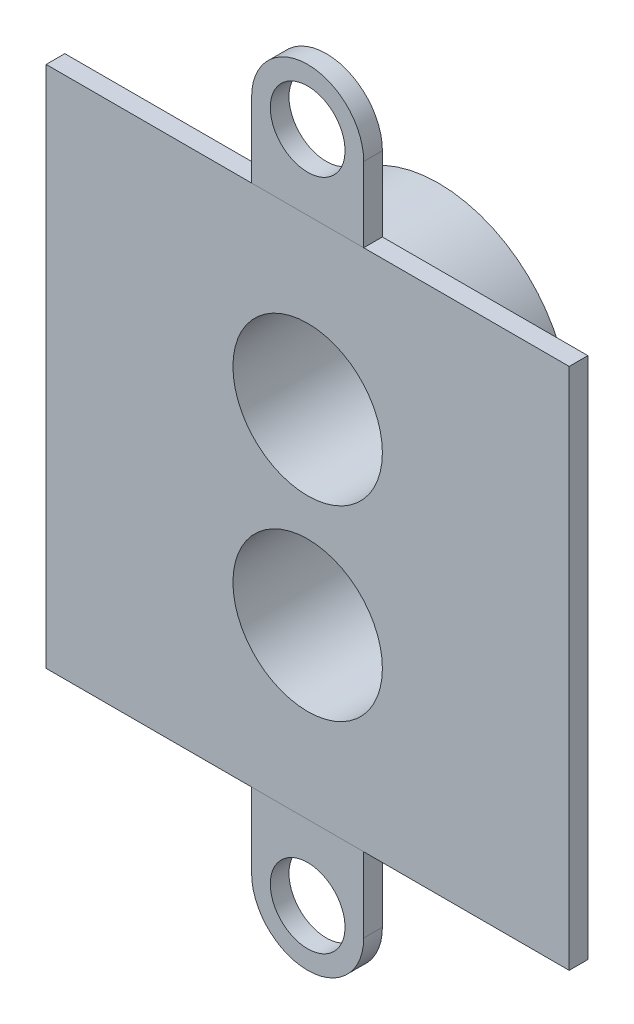
ISO-10303-21;
HEADER;
FILE_DESCRIPTION(('STEP AP214'),'2;1');
FILE_NAME('part.step','',(''),(''),'','','');
FILE_SCHEMA(('AUTOMOTIVE_DESIGN { 1 0 10303 214 1 1 1 1 }'));
ENDSEC;
DATA;
#1=APPLICATION_CONTEXT('core data for automotive mechanical design processes');
#2=APPLICATION_PROTOCOL_DEFINITION('international standard','automotive_design',2000,#1);
#3=PRODUCT_CONTEXT('',#1,'mechanical');
#4=PRODUCT('Part','Part','',(#3));
#5=PRODUCT_RELATED_PRODUCT_CATEGORY('part','',(#4));
#6=PRODUCT_DEFINITION_FORMATION('','',#4);
#7=PRODUCT_DEFINITION_CONTEXT('part definition',#1,'design');
#8=PRODUCT_DEFINITION('design','',#6,#7);
#9=PRODUCT_DEFINITION_SHAPE('','',#8);
#10=(LENGTH_UNIT() NAMED_UNIT(*) SI_UNIT(.MILLI.,.METRE.));
#11=(NAMED_UNIT(*) PLANE_ANGLE_UNIT() SI_UNIT($,.RADIAN.));
#12=(NAMED_UNIT(*) SI_UNIT($,.STERADIAN.) SOLID_ANGLE_UNIT());
#13=UNCERTAINTY_MEASURE_WITH_UNIT(LENGTH_MEASURE(1.E-05),#10,'distance_accuracy_value','');
#14=(GEOMETRIC_REPRESENTATION_CONTEXT(3) GLOBAL_UNCERTAINTY_ASSIGNED_CONTEXT((#13)) GLOBAL_UNIT_ASSIGNED_CONTEXT((#10,
#11,#12)) REPRESENTATION_CONTEXT('',''));
#15=CARTESIAN_POINT('',(0.,0.,0.));
#16=DIRECTION('',(0.,0.,1.));
#17=DIRECTION('',(1.,0.,0.));
#18=AXIS2_PLACEMENT_3D('',#15,#16,#17);
#19=CARTESIAN_POINT('',(-1.5,10.5,0.5));
#20=DIRECTION('',(0.,0.,-1.));
#21=DIRECTION('',(-1.,0.,0.));
#22=AXIS2_PLACEMENT_3D('',#19,#20,#21);
#23=PLANE('',#22);
#24=CARTESIAN_POINT('',(0.,9.,0.5));
#25=DIRECTION('',(0.,0.,1.));
#26=DIRECTION('',(-1.,0.,0.));
#27=AXIS2_PLACEMENT_3D('',#24,#25,#26);
#28=CIRCLE('',#27,1.);
#29=CARTESIAN_POINT('',(-1.,9.,0.5));
#30=VERTEX_POINT('',#29);
#31=EDGE_CURVE('E121',#30,#30,#28,.T.);
#32=ORIENTED_EDGE('',*,*,#31,.F.);
#33=EDGE_LOOP('',(#32));
#34=FACE_BOUND('',#33,.T.);
#35=CARTESIAN_POINT('',(0.,9.,0.5));
#36=DIRECTION('',(0.,0.,1.));
#37=DIRECTION('',(-1.,0.,0.));
#38=AXIS2_PLACEMENT_3D('',#35,#36,#37);
#39=CIRCLE('',#38,1.5);
#40=CARTESIAN_POINT('',(1.5,9.,0.5));
#41=VERTEX_POINT('',#40);
#42=CARTESIAN_POINT('',(-1.5,9.,0.5));
#43=VERTEX_POINT('',#42);
#44=EDGE_CURVE('E112',#41,#43,#39,.T.);
#45=ORIENTED_EDGE('',*,*,#44,.T.);
#46=DIRECTION('',(0.,-1.,0.));
#47=VECTOR('',#46,1.);
#48=CARTESIAN_POINT('',(-1.5,10.5,0.5));
#49=LINE('',#48,#47);
#50=CARTESIAN_POINT('',(-1.5,7.,0.5));
#51=VERTEX_POINT('',#50);
#52=EDGE_CURVE('E125',#43,#51,#49,.T.);
#53=ORIENTED_EDGE('',*,*,#52,.T.);
#54=DIRECTION('',(-1.,0.,0.));
#55=VECTOR('',#54,1.);
#56=CARTESIAN_POINT('',(-1.5,7.,0.5));
#57=LINE('',#56,#55);
#58=CARTESIAN_POINT('',(1.5,7.,0.5));
#59=VERTEX_POINT('',#58);
#60=EDGE_CURVE('E133',#59,#51,#57,.T.);
#61=ORIENTED_EDGE('',*,*,#60,.F.);
#62=DIRECTION('',(0.,-1.,0.));
#63=VECTOR('',#62,1.);
#64=CARTESIAN_POINT('',(1.5,10.5,0.5));
#65=LINE('',#64,#63);
#66=EDGE_CURVE('E74',#41,#59,#65,.T.);
#67=ORIENTED_EDGE('',*,*,#66,.F.);
#68=EDGE_LOOP('',(#45,#53,#61,#67));
#69=FACE_BOUND('',#68,.T.);
#70=ADVANCED_FACE('F66',(#34,#69),#23,.F.);
#71=CARTESIAN_POINT('',(-1.5,10.5,0.));
#72=DIRECTION('',(0.,0.,1.));
#73=DIRECTION('',(1.,0.,0.));
#74=AXIS2_PLACEMENT_3D('',#71,#72,#73);
#75=PLANE('',#74);
#76=CARTESIAN_POINT('',(0.,9.,0.));
#77=DIRECTION('',(0.,0.,1.));
#78=DIRECTION('',(-1.,0.,0.));
#79=AXIS2_PLACEMENT_3D('',#76,#77,#78);
#80=CIRCLE('',#79,1.);
#81=CARTESIAN_POINT('',(-1.,9.,0.));
#82=VERTEX_POINT('',#81);
#83=EDGE_CURVE('E142',#82,#82,#80,.T.);
#84=ORIENTED_EDGE('',*,*,#83,.T.);
#85=EDGE_LOOP('',(#84));
#86=FACE_BOUND('',#85,.T.);
#87=DIRECTION('',(0.,-1.,0.));
#88=VECTOR('',#87,1.);
#89=CARTESIAN_POINT('',(1.5,10.5,0.));
#90=LINE('',#89,#88);
#91=CARTESIAN_POINT('',(1.5,9.,0.));
#92=VERTEX_POINT('',#91);
#93=CARTESIAN_POINT('',(1.5,7.,0.));
#94=VERTEX_POINT('',#93);
#95=EDGE_CURVE('E118',#92,#94,#90,.T.);
#96=ORIENTED_EDGE('',*,*,#95,.T.);
#97=DIRECTION('',(1.,0.,0.));
#98=VECTOR('',#97,1.);
#99=CARTESIAN_POINT('',(-1.5,7.,0.));
#100=LINE('',#99,#98);
#101=CARTESIAN_POINT('',(-1.5,7.,0.));
#102=VERTEX_POINT('',#101);
#103=EDGE_CURVE('E123',#102,#94,#100,.T.);
#104=ORIENTED_EDGE('',*,*,#103,.F.);
#105=DIRECTION('',(0.,-1.,0.));
#106=VECTOR('',#105,1.);
#107=CARTESIAN_POINT('',(-1.5,10.5,0.));
#108=LINE('',#107,#106);
#109=CARTESIAN_POINT('',(-1.5,9.,0.));
#110=VERTEX_POINT('',#109);
#111=EDGE_CURVE('E119',#110,#102,#108,.T.);
#112=ORIENTED_EDGE('',*,*,#111,.F.);
#113=CARTESIAN_POINT('',(0.,9.,0.));
#114=DIRECTION('',(0.,0.,1.));
#115=DIRECTION('',(-1.,0.,0.));
#116=AXIS2_PLACEMENT_3D('',#113,#114,#115);
#117=CIRCLE('',#116,1.5);
#118=EDGE_CURVE('E109',#92,#110,#117,.T.);
#119=ORIENTED_EDGE('',*,*,#118,.F.);
#120=EDGE_LOOP('',(#96,#104,#112,#119));
#121=FACE_BOUND('',#120,.T.);
#122=ADVANCED_FACE('F116',(#86,#121),#75,.F.);
#123=CARTESIAN_POINT('',(-1.5,10.5,0.5));
#124=DIRECTION('',(1.,0.,0.));
#125=DIRECTION('',(0.,-1.,0.));
#126=AXIS2_PLACEMENT_3D('',#123,#124,#125);
#127=PLANE('',#126);
#128=DIRECTION('',(0.,0.,-1.));
#129=VECTOR('',#128,1.);
#130=CARTESIAN_POINT('',(-1.5,9.,4.));
#131=LINE('',#130,#129);
#132=EDGE_CURVE('E120',#43,#110,#131,.T.);
#133=ORIENTED_EDGE('',*,*,#132,.T.);
#134=ORIENTED_EDGE('',*,*,#111,.T.);
#135=DIRECTION('',(0.,0.,-1.));
#136=VECTOR('',#135,1.);
#137=CARTESIAN_POINT('',(-1.5,7.,0.5));
#138=LINE('',#137,#136);
#139=EDGE_CURVE('E88',#51,#102,#138,.T.);
#140=ORIENTED_EDGE('',*,*,#139,.F.);
#141=ORIENTED_EDGE('',*,*,#52,.F.);
#142=EDGE_LOOP('',(#133,#134,#140,#141));
#143=FACE_BOUND('',#142,.T.);
#144=ADVANCED_FACE('F157',(#143),#127,.F.);
#145=CARTESIAN_POINT('',(1.5,10.5,0.5));
#146=DIRECTION('',(-1.,0.,0.));
#147=DIRECTION('',(0.,1.,0.));
#148=AXIS2_PLACEMENT_3D('',#145,#146,#147);
#149=PLANE('',#148);
#150=ORIENTED_EDGE('',*,*,#66,.T.);
#151=DIRECTION('',(0.,0.,1.));
#152=VECTOR('',#151,1.);
#153=CARTESIAN_POINT('',(1.5,7.,0.5));
#154=LINE('',#153,#152);
#155=EDGE_CURVE('E81',#94,#59,#154,.T.);
#156=ORIENTED_EDGE('',*,*,#155,.F.);
#157=ORIENTED_EDGE('',*,*,#95,.F.);
#158=DIRECTION('',(0.,0.,-1.));
#159=VECTOR('',#158,1.);
#160=CARTESIAN_POINT('',(1.5,9.,4.));
#161=LINE('',#160,#159);
#162=EDGE_CURVE('E13',#41,#92,#161,.T.);
#163=ORIENTED_EDGE('',*,*,#162,.F.);
#164=EDGE_LOOP('',(#150,#156,#157,#163));
#165=FACE_BOUND('',#164,.T.);
#166=ADVANCED_FACE('F68',(#165),#149,.F.);
#167=CARTESIAN_POINT('',(0.,7.,0.));
#168=DIRECTION('',(0.,1.,0.));
#169=DIRECTION('',(0.,0.,-1.));
#170=AXIS2_PLACEMENT_3D('',#167,#168,#169);
#171=PLANE('',#170);
#172=ORIENTED_EDGE('',*,*,#155,.T.);
#173=ORIENTED_EDGE('',*,*,#60,.T.);
#174=ORIENTED_EDGE('',*,*,#139,.T.);
#175=ORIENTED_EDGE('',*,*,#103,.T.);
#176=EDGE_LOOP('',(#172,#173,#174,#175));
#177=FACE_BOUND('',#176,.T.);
#178=ADVANCED_FACE('F163',(#177),#171,.F.);
#179=CARTESIAN_POINT('',(0.,9.,4.));
#180=DIRECTION('',(0.,0.,-1.));
#181=DIRECTION('',(-1.,0.,0.));
#182=AXIS2_PLACEMENT_3D('',#179,#180,#181);
#183=CYLINDRICAL_SURFACE('',#182,1.5);
#184=ORIENTED_EDGE('',*,*,#44,.F.);
#185=ORIENTED_EDGE('',*,*,#162,.T.);
#186=ORIENTED_EDGE('',*,*,#118,.T.);
#187=ORIENTED_EDGE('',*,*,#132,.F.);
#188=EDGE_LOOP('',(#184,#185,#186,#187));
#189=FACE_BOUND('',#188,.T.);
#190=ADVANCED_FACE('F108',(#189),#183,.T.);
#191=CARTESIAN_POINT('',(0.,9.,4.));
#192=DIRECTION('',(0.,0.,-1.));
#193=DIRECTION('',(-1.,0.,0.));
#194=AXIS2_PLACEMENT_3D('',#191,#192,#193);
#195=CYLINDRICAL_SURFACE('',#194,1.);
#196=ORIENTED_EDGE('',*,*,#83,.F.);
#197=EDGE_LOOP('',(#196));
#198=FACE_BOUND('',#197,.T.);
#199=ORIENTED_EDGE('',*,*,#31,.T.);
#200=EDGE_LOOP('',(#199));
#201=FACE_BOUND('',#200,.T.);
#202=ADVANCED_FACE('F147',(#198,#201),#195,.F.);
#203=CLOSED_SHELL('',(#70,#122,#144,#166,#178,#190,#202));
#204=MANIFOLD_SOLID_BREP('B2',#203);
#205=CARTESIAN_POINT('',(-1.5,-10.5,0.5));
#206=DIRECTION('',(0.,0.,-1.));
#207=DIRECTION('',(-1.,0.,0.));
#208=AXIS2_PLACEMENT_3D('',#205,#206,#207);
#209=PLANE('',#208);
#210=CARTESIAN_POINT('',(0.,-9.,0.5));
#211=DIRECTION('',(0.,0.,-1.));
#212=DIRECTION('',(-1.,0.,0.));
#213=AXIS2_PLACEMENT_3D('',#210,#211,#212);
#214=CIRCLE('',#213,1.);
#215=CARTESIAN_POINT('',(-1.,-9.,0.5));
#216=VERTEX_POINT('',#215);
#217=EDGE_CURVE('E270',#216,#216,#214,.T.);
#218=ORIENTED_EDGE('',*,*,#217,.T.);
#219=EDGE_LOOP('',(#218));
#220=FACE_BOUND('',#219,.T.);
#221=CARTESIAN_POINT('',(0.,-9.,0.5));
#222=DIRECTION('',(0.,0.,-1.));
#223=DIRECTION('',(-1.,0.,0.));
#224=AXIS2_PLACEMENT_3D('',#221,#222,#223);
#225=CIRCLE('',#224,1.5);
#226=CARTESIAN_POINT('',(1.5,-9.,0.5));
#227=VERTEX_POINT('',#226);
#228=CARTESIAN_POINT('',(-1.5,-9.,0.5));
#229=VERTEX_POINT('',#228);
#230=EDGE_CURVE('E289',#227,#229,#225,.T.);
#231=ORIENTED_EDGE('',*,*,#230,.F.);
#232=DIRECTION('',(0.,1.,0.));
#233=VECTOR('',#232,1.);
#234=CARTESIAN_POINT('',(1.5,-10.5,0.5));
#235=LINE('',#234,#233);
#236=CARTESIAN_POINT('',(1.5,-7.,0.5));
#237=VERTEX_POINT('',#236);
#238=EDGE_CURVE('E231',#227,#237,#235,.T.);
#239=ORIENTED_EDGE('',*,*,#238,.T.);
#240=DIRECTION('',(-1.,0.,0.));
#241=VECTOR('',#240,1.);
#242=CARTESIAN_POINT('',(-1.5,-7.,0.5));
#243=LINE('',#242,#241);
#244=CARTESIAN_POINT('',(-1.5,-7.,0.5));
#245=VERTEX_POINT('',#244);
#246=EDGE_CURVE('E287',#237,#245,#243,.T.);
#247=ORIENTED_EDGE('',*,*,#246,.T.);
#248=DIRECTION('',(0.,1.,0.));
#249=VECTOR('',#248,1.);
#250=CARTESIAN_POINT('',(-1.5,-10.5,0.5));
#251=LINE('',#250,#249);
#252=EDGE_CURVE('E277',#229,#245,#251,.T.);
#253=ORIENTED_EDGE('',*,*,#252,.F.);
#254=EDGE_LOOP('',(#231,#239,#247,#253));
#255=FACE_BOUND('',#254,.T.);
#256=ADVANCED_FACE('F223',(#220,#255),#209,.F.);
#257=CARTESIAN_POINT('',(-1.5,-10.5,0.));
#258=DIRECTION('',(0.,0.,1.));
#259=DIRECTION('',(1.,0.,0.));
#260=AXIS2_PLACEMENT_3D('',#257,#258,#259);
#261=PLANE('',#260);
#262=CARTESIAN_POINT('',(0.,-9.,0.));
#263=DIRECTION('',(0.,0.,-1.));
#264=DIRECTION('',(-1.,0.,0.));
#265=AXIS2_PLACEMENT_3D('',#262,#263,#264);
#266=CIRCLE('',#265,1.);
#267=CARTESIAN_POINT('',(-1.,-9.,0.));
#268=VERTEX_POINT('',#267);
#269=EDGE_CURVE('E302',#268,#268,#266,.T.);
#270=ORIENTED_EDGE('',*,*,#269,.F.);
#271=EDGE_LOOP('',(#270));
#272=FACE_BOUND('',#271,.T.);
#273=DIRECTION('',(0.,1.,0.));
#274=VECTOR('',#273,1.);
#275=CARTESIAN_POINT('',(1.5,-10.5,0.));
#276=LINE('',#275,#274);
#277=CARTESIAN_POINT('',(1.5,-9.,0.));
#278=VERTEX_POINT('',#277);
#279=CARTESIAN_POINT('',(1.5,-7.,0.));
#280=VERTEX_POINT('',#279);
#281=EDGE_CURVE('E237',#278,#280,#276,.T.);
#282=ORIENTED_EDGE('',*,*,#281,.F.);
#283=CARTESIAN_POINT('',(0.,-9.,0.));
#284=DIRECTION('',(0.,0.,-1.));
#285=DIRECTION('',(-1.,0.,0.));
#286=AXIS2_PLACEMENT_3D('',#283,#284,#285);
#287=CIRCLE('',#286,1.5);
#288=CARTESIAN_POINT('',(-1.5,-9.,0.));
#289=VERTEX_POINT('',#288);
#290=EDGE_CURVE('E265',#278,#289,#287,.T.);
#291=ORIENTED_EDGE('',*,*,#290,.T.);
#292=DIRECTION('',(0.,1.,0.));
#293=VECTOR('',#292,1.);
#294=CARTESIAN_POINT('',(-1.5,-10.5,0.));
#295=LINE('',#294,#293);
#296=CARTESIAN_POINT('',(-1.5,-7.,0.));
#297=VERTEX_POINT('',#296);
#298=EDGE_CURVE('E244',#289,#297,#295,.T.);
#299=ORIENTED_EDGE('',*,*,#298,.T.);
#300=DIRECTION('',(1.,0.,0.));
#301=VECTOR('',#300,1.);
#302=CARTESIAN_POINT('',(-1.5,-7.,0.));
#303=LINE('',#302,#301);
#304=EDGE_CURVE('E274',#297,#280,#303,.T.);
#305=ORIENTED_EDGE('',*,*,#304,.T.);
#306=EDGE_LOOP('',(#282,#291,#299,#305));
#307=FACE_BOUND('',#306,.T.);
#308=ADVANCED_FACE('F272',(#272,#307),#261,.F.);
#309=CARTESIAN_POINT('',(-1.5,-10.5,0.5));
#310=DIRECTION('',(1.,0.,0.));
#311=DIRECTION('',(0.,1.,0.));
#312=AXIS2_PLACEMENT_3D('',#309,#310,#311);
#313=PLANE('',#312);
#314=DIRECTION('',(0.,0.,-1.));
#315=VECTOR('',#314,1.);
#316=CARTESIAN_POINT('',(-1.5,-9.,4.));
#317=LINE('',#316,#315);
#318=EDGE_CURVE('E269',#229,#289,#317,.T.);
#319=ORIENTED_EDGE('',*,*,#318,.F.);
#320=ORIENTED_EDGE('',*,*,#252,.T.);
#321=DIRECTION('',(0.,0.,-1.));
#322=VECTOR('',#321,1.);
#323=CARTESIAN_POINT('',(-1.5,-7.,0.5));
#324=LINE('',#323,#322);
#325=EDGE_CURVE('E279',#245,#297,#324,.T.);
#326=ORIENTED_EDGE('',*,*,#325,.T.);
#327=ORIENTED_EDGE('',*,*,#298,.F.);
#328=EDGE_LOOP('',(#319,#320,#326,#327));
#329=FACE_BOUND('',#328,.T.);
#330=ADVANCED_FACE('F298',(#329),#313,.F.);
#331=CARTESIAN_POINT('',(1.5,-10.5,0.5));
#332=DIRECTION('',(-1.,0.,0.));
#333=DIRECTION('',(0.,-1.,0.));
#334=AXIS2_PLACEMENT_3D('',#331,#332,#333);
#335=PLANE('',#334);
#336=ORIENTED_EDGE('',*,*,#238,.F.);
#337=DIRECTION('',(0.,0.,-1.));
#338=VECTOR('',#337,1.);
#339=CARTESIAN_POINT('',(1.5,-9.,4.));
#340=LINE('',#339,#338);
#341=EDGE_CURVE('E64',#227,#278,#340,.T.);
#342=ORIENTED_EDGE('',*,*,#341,.T.);
#343=ORIENTED_EDGE('',*,*,#281,.T.);
#344=DIRECTION('',(0.,0.,1.));
#345=VECTOR('',#344,1.);
#346=CARTESIAN_POINT('',(1.5,-7.,0.5));
#347=LINE('',#346,#345);
#348=EDGE_CURVE('E292',#280,#237,#347,.T.);
#349=ORIENTED_EDGE('',*,*,#348,.T.);
#350=EDGE_LOOP('',(#336,#342,#343,#349));
#351=FACE_BOUND('',#350,.T.);
#352=ADVANCED_FACE('F225',(#351),#335,.F.);
#353=CARTESIAN_POINT('',(0.,-7.,0.));
#354=DIRECTION('',(0.,-1.,0.));
#355=DIRECTION('',(0.,0.,-1.));
#356=AXIS2_PLACEMENT_3D('',#353,#354,#355);
#357=PLANE('',#356);
#358=ORIENTED_EDGE('',*,*,#348,.F.);
#359=ORIENTED_EDGE('',*,*,#304,.F.);
#360=ORIENTED_EDGE('',*,*,#325,.F.);
#361=ORIENTED_EDGE('',*,*,#246,.F.);
#362=EDGE_LOOP('',(#358,#359,#360,#361));
#363=FACE_BOUND('',#362,.T.);
#364=ADVANCED_FACE('F291',(#363),#357,.F.);
#365=CARTESIAN_POINT('',(0.,-9.,4.));
#366=DIRECTION('',(0.,0.,-1.));
#367=DIRECTION('',(-1.,0.,0.));
#368=AXIS2_PLACEMENT_3D('',#365,#366,#367);
#369=CYLINDRICAL_SURFACE('',#368,1.5);
#370=ORIENTED_EDGE('',*,*,#230,.T.);
#371=ORIENTED_EDGE('',*,*,#318,.T.);
#372=ORIENTED_EDGE('',*,*,#290,.F.);
#373=ORIENTED_EDGE('',*,*,#341,.F.);
#374=EDGE_LOOP('',(#370,#371,#372,#373));
#375=FACE_BOUND('',#374,.T.);
#376=ADVANCED_FACE('F266',(#375),#369,.T.);
#377=CARTESIAN_POINT('',(0.,-9.,4.));
#378=DIRECTION('',(0.,0.,-1.));
#379=DIRECTION('',(-1.,0.,0.));
#380=AXIS2_PLACEMENT_3D('',#377,#378,#379);
#381=CYLINDRICAL_SURFACE('',#380,1.);
#382=ORIENTED_EDGE('',*,*,#269,.T.);
#383=EDGE_LOOP('',(#382));
#384=FACE_BOUND('',#383,.T.);
#385=ORIENTED_EDGE('',*,*,#217,.F.);
#386=EDGE_LOOP('',(#385));
#387=FACE_BOUND('',#386,.T.);
#388=ADVANCED_FACE('F306',(#384,#387),#381,.F.);
#389=CLOSED_SHELL('',(#256,#308,#330,#352,#364,#376,#388));
#390=MANIFOLD_SOLID_BREP('B7',#389);
#391=CARTESIAN_POINT('',(0.,0.,0.));
#392=DIRECTION('',(0.,0.,1.));
#393=DIRECTION('',(1.,0.,0.));
#394=AXIS2_PLACEMENT_3D('',#391,#392,#393);
#395=PLANE('',#394);
#396=DIRECTION('',(0.,1.,0.));
#397=VECTOR('',#396,1.);
#398=CARTESIAN_POINT('',(-7.,0.,0.));
#399=LINE('',#398,#397);
#400=CARTESIAN_POINT('',(-7.,-7.,0.));
#401=VERTEX_POINT('',#400);
#402=CARTESIAN_POINT('',(-7.,7.,0.));
#403=VERTEX_POINT('',#402);
#404=EDGE_CURVE('E446',#401,#403,#399,.T.);
#405=ORIENTED_EDGE('',*,*,#404,.T.);
#406=DIRECTION('',(-1.,0.,0.));
#407=VECTOR('',#406,1.);
#408=CARTESIAN_POINT('',(0.,7.,0.));
#409=LINE('',#408,#407);
#410=CARTESIAN_POINT('',(7.,7.,0.));
#411=VERTEX_POINT('',#410);
#412=EDGE_CURVE('E458',#411,#403,#409,.T.);
#413=ORIENTED_EDGE('',*,*,#412,.F.);
#414=DIRECTION('',(0.,1.,0.));
#415=VECTOR('',#414,1.);
#416=CARTESIAN_POINT('',(7.,0.,0.));
#417=LINE('',#416,#415);
#418=CARTESIAN_POINT('',(7.,-7.,0.));
#419=VERTEX_POINT('',#418);
#420=EDGE_CURVE('E471',#419,#411,#417,.T.);
#421=ORIENTED_EDGE('',*,*,#420,.F.);
#422=DIRECTION('',(-1.,0.,0.));
#423=VECTOR('',#422,1.);
#424=CARTESIAN_POINT('',(0.,-7.,0.));
#425=LINE('',#424,#423);
#426=EDGE_CURVE('E449',#419,#401,#425,.T.);
#427=ORIENTED_EDGE('',*,*,#426,.T.);
#428=EDGE_LOOP('',(#405,#413,#421,#427));
#429=FACE_BOUND('',#428,.T.);
#430=CARTESIAN_POINT('',(0.,-2.5,0.));
#431=DIRECTION('',(0.,0.,-1.));
#432=DIRECTION('',(-1.,0.,0.));
#433=AXIS2_PLACEMENT_3D('',#430,#431,#432);
#434=CIRCLE('',#433,3.5);
#435=CARTESIAN_POINT('',(2.44948974278318,0.,0.));
#436=VERTEX_POINT('',#435);
#437=CARTESIAN_POINT('',(-2.44948974278318,0.,0.));
#438=VERTEX_POINT('',#437);
#439=EDGE_CURVE('E445',#436,#438,#434,.T.);
#440=ORIENTED_EDGE('',*,*,#439,.F.);
#441=CARTESIAN_POINT('',(0.,2.5,0.));
#442=DIRECTION('',(0.,0.,-1.));
#443=DIRECTION('',(-1.,0.,0.));
#444=AXIS2_PLACEMENT_3D('',#441,#442,#443);
#445=CIRCLE('',#444,3.5);
#446=EDGE_CURVE('E385',#438,#436,#445,.T.);
#447=ORIENTED_EDGE('',*,*,#446,.F.);
#448=EDGE_LOOP('',(#440,#447));
#449=FACE_BOUND('',#448,.T.);
#450=ADVANCED_FACE('F371',(#429,#449),#395,.F.);
#451=CARTESIAN_POINT('',(-7.,0.,0.5));
#452=DIRECTION('',(-1.,0.,0.));
#453=DIRECTION('',(0.,0.,1.));
#454=AXIS2_PLACEMENT_3D('',#451,#452,#453);
#455=PLANE('',#454);
#456=ORIENTED_EDGE('',*,*,#404,.F.);
#457=DIRECTION('',(0.,0.,-1.));
#458=VECTOR('',#457,1.);
#459=CARTESIAN_POINT('',(-7.,-7.,0.5));
#460=LINE('',#459,#458);
#461=CARTESIAN_POINT('',(-7.,-7.,0.5));
#462=VERTEX_POINT('',#461);
#463=EDGE_CURVE('E221',#462,#401,#460,.T.);
#464=ORIENTED_EDGE('',*,*,#463,.F.);
#465=DIRECTION('',(0.,1.,0.));
#466=VECTOR('',#465,1.);
#467=CARTESIAN_POINT('',(-7.,0.,0.5));
#468=LINE('',#467,#466);
#469=CARTESIAN_POINT('',(-7.,7.,0.5));
#470=VERTEX_POINT('',#469);
#471=EDGE_CURVE('E461',#462,#470,#468,.T.);
#472=ORIENTED_EDGE('',*,*,#471,.T.);
#473=DIRECTION('',(0.,0.,-1.));
#474=VECTOR('',#473,1.);
#475=CARTESIAN_POINT('',(-7.,7.,0.5));
#476=LINE('',#475,#474);
#477=EDGE_CURVE('E414',#470,#403,#476,.T.);
#478=ORIENTED_EDGE('',*,*,#477,.T.);
#479=EDGE_LOOP('',(#456,#464,#472,#478));
#480=FACE_BOUND('',#479,.T.);
#481=ADVANCED_FACE('F488',(#480),#455,.T.);
#482=CARTESIAN_POINT('',(0.,-7.,0.5));
#483=DIRECTION('',(0.,-1.,0.));
#484=DIRECTION('',(1.,0.,0.));
#485=AXIS2_PLACEMENT_3D('',#482,#483,#484);
#486=PLANE('',#485);
#487=ORIENTED_EDGE('',*,*,#426,.F.);
#488=DIRECTION('',(0.,0.,-1.));
#489=VECTOR('',#488,1.);
#490=CARTESIAN_POINT('',(7.,-7.,0.5));
#491=LINE('',#490,#489);
#492=CARTESIAN_POINT('',(7.,-7.,0.5));
#493=VERTEX_POINT('',#492);
#494=EDGE_CURVE('E379',#493,#419,#491,.T.);
#495=ORIENTED_EDGE('',*,*,#494,.F.);
#496=DIRECTION('',(-1.,0.,0.));
#497=VECTOR('',#496,1.);
#498=CARTESIAN_POINT('',(0.,-7.,0.5));
#499=LINE('',#498,#497);
#500=EDGE_CURVE('E463',#493,#462,#499,.T.);
#501=ORIENTED_EDGE('',*,*,#500,.T.);
#502=ORIENTED_EDGE('',*,*,#463,.T.);
#503=EDGE_LOOP('',(#487,#495,#501,#502));
#504=FACE_BOUND('',#503,.T.);
#505=ADVANCED_FACE('F487',(#504),#486,.T.);
#506=CARTESIAN_POINT('',(7.,0.,0.5));
#507=DIRECTION('',(-1.,0.,0.));
#508=DIRECTION('',(0.,0.,1.));
#509=AXIS2_PLACEMENT_3D('',#506,#507,#508);
#510=PLANE('',#509);
#511=ORIENTED_EDGE('',*,*,#420,.T.);
#512=DIRECTION('',(0.,0.,-1.));
#513=VECTOR('',#512,1.);
#514=CARTESIAN_POINT('',(7.,7.,0.5));
#515=LINE('',#514,#513);
#516=CARTESIAN_POINT('',(7.,7.,0.5));
#517=VERTEX_POINT('',#516);
#518=EDGE_CURVE('E476',#517,#411,#515,.T.);
#519=ORIENTED_EDGE('',*,*,#518,.F.);
#520=DIRECTION('',(0.,1.,0.));
#521=VECTOR('',#520,1.);
#522=CARTESIAN_POINT('',(7.,0.,0.5));
#523=LINE('',#522,#521);
#524=EDGE_CURVE('E466',#493,#517,#523,.T.);
#525=ORIENTED_EDGE('',*,*,#524,.F.);
#526=ORIENTED_EDGE('',*,*,#494,.T.);
#527=EDGE_LOOP('',(#511,#519,#525,#526));
#528=FACE_BOUND('',#527,.T.);
#529=ADVANCED_FACE('F481',(#528),#510,.F.);
#530=CARTESIAN_POINT('',(0.,2.5,0.5));
#531=DIRECTION('',(0.,0.,-1.));
#532=DIRECTION('',(-1.,0.,0.));
#533=AXIS2_PLACEMENT_3D('',#530,#531,#532);
#534=CYLINDRICAL_SURFACE('',#533,2.);
#535=CARTESIAN_POINT('',(0.,2.5,0.5));
#536=DIRECTION('',(0.,0.,1.));
#537=DIRECTION('',(1.,0.,0.));
#538=AXIS2_PLACEMENT_3D('',#535,#536,#537);
#539=CIRCLE('',#538,2.);
#540=CARTESIAN_POINT('',(2.,2.5,0.5));
#541=VERTEX_POINT('',#540);
#542=EDGE_CURVE('E457',#541,#541,#539,.T.);
#543=ORIENTED_EDGE('',*,*,#542,.T.);
#544=EDGE_LOOP('',(#543));
#545=FACE_BOUND('',#544,.T.);
#546=CARTESIAN_POINT('',(0.,2.5,-3.));
#547=DIRECTION('',(0.,0.,-1.));
#548=DIRECTION('',(-1.,0.,0.));
#549=AXIS2_PLACEMENT_3D('',#546,#547,#548);
#550=CIRCLE('',#549,2.);
#551=CARTESIAN_POINT('',(-2.,2.5,-3.));
#552=VERTEX_POINT('',#551);
#553=EDGE_CURVE('E511',#552,#552,#550,.T.);
#554=ORIENTED_EDGE('',*,*,#553,.T.);
#555=EDGE_LOOP('',(#554));
#556=FACE_BOUND('',#555,.T.);
#557=ADVANCED_FACE('F498',(#545,#556),#534,.F.);
#558=CARTESIAN_POINT('',(0.,-2.5,0.5));
#559=DIRECTION('',(0.,0.,-1.));
#560=DIRECTION('',(-1.,0.,0.));
#561=AXIS2_PLACEMENT_3D('',#558,#559,#560);
#562=CYLINDRICAL_SURFACE('',#561,2.);
#563=CARTESIAN_POINT('',(0.,-2.5,0.5));
#564=DIRECTION('',(0.,0.,1.));
#565=DIRECTION('',(1.,0.,0.));
#566=AXIS2_PLACEMENT_3D('',#563,#564,#565);
#567=CIRCLE('',#566,2.);
#568=CARTESIAN_POINT('',(2.,-2.5,0.5));
#569=VERTEX_POINT('',#568);
#570=EDGE_CURVE('E454',#569,#569,#567,.T.);
#571=ORIENTED_EDGE('',*,*,#570,.T.);
#572=EDGE_LOOP('',(#571));
#573=FACE_BOUND('',#572,.T.);
#574=CARTESIAN_POINT('',(0.,-2.5,-3.));
#575=DIRECTION('',(0.,0.,-1.));
#576=DIRECTION('',(-1.,0.,0.));
#577=AXIS2_PLACEMENT_3D('',#574,#575,#576);
#578=CIRCLE('',#577,2.);
#579=CARTESIAN_POINT('',(-2.,-2.5,-3.));
#580=VERTEX_POINT('',#579);
#581=EDGE_CURVE('E512',#580,#580,#578,.T.);
#582=ORIENTED_EDGE('',*,*,#581,.T.);
#583=EDGE_LOOP('',(#582));
#584=FACE_BOUND('',#583,.T.);
#585=ADVANCED_FACE('F373',(#573,#584),#562,.F.);
#586=CARTESIAN_POINT('',(0.,7.,0.5));
#587=DIRECTION('',(0.,-1.,0.));
#588=DIRECTION('',(1.,0.,0.));
#589=AXIS2_PLACEMENT_3D('',#586,#587,#588);
#590=PLANE('',#589);
#591=ORIENTED_EDGE('',*,*,#412,.T.);
#592=ORIENTED_EDGE('',*,*,#477,.F.);
#593=DIRECTION('',(-1.,0.,0.));
#594=VECTOR('',#593,1.);
#595=CARTESIAN_POINT('',(0.,7.,0.5));
#596=LINE('',#595,#594);
#597=EDGE_CURVE('E394',#517,#470,#596,.T.);
#598=ORIENTED_EDGE('',*,*,#597,.F.);
#599=ORIENTED_EDGE('',*,*,#518,.T.);
#600=EDGE_LOOP('',(#591,#592,#598,#599));
#601=FACE_BOUND('',#600,.T.);
#602=ADVANCED_FACE('F505',(#601),#590,.F.);
#603=CARTESIAN_POINT('',(0.,0.,0.5));
#604=DIRECTION('',(0.,0.,1.));
#605=DIRECTION('',(1.,0.,0.));
#606=AXIS2_PLACEMENT_3D('',#603,#604,#605);
#607=PLANE('',#606);
#608=ORIENTED_EDGE('',*,*,#570,.F.);
#609=EDGE_LOOP('',(#608));
#610=FACE_BOUND('',#609,.T.);
#611=ORIENTED_EDGE('',*,*,#542,.F.);
#612=EDGE_LOOP('',(#611));
#613=FACE_BOUND('',#612,.T.);
#614=ORIENTED_EDGE('',*,*,#471,.F.);
#615=ORIENTED_EDGE('',*,*,#500,.F.);
#616=ORIENTED_EDGE('',*,*,#524,.T.);
#617=ORIENTED_EDGE('',*,*,#597,.T.);
#618=EDGE_LOOP('',(#614,#615,#616,#617));
#619=FACE_BOUND('',#618,.T.);
#620=ADVANCED_FACE('F521',(#610,#613,#619),#607,.T.);
#621=CARTESIAN_POINT('',(0.,0.,-3.));
#622=DIRECTION('',(0.,0.,-1.));
#623=DIRECTION('',(-1.,0.,0.));
#624=AXIS2_PLACEMENT_3D('',#621,#622,#623);
#625=PLANE('',#624);
#626=ORIENTED_EDGE('',*,*,#581,.F.);
#627=EDGE_LOOP('',(#626));
#628=FACE_BOUND('',#627,.T.);
#629=CARTESIAN_POINT('',(0.,-2.5,-3.));
#630=DIRECTION('',(0.,0.,-1.));
#631=DIRECTION('',(-1.,0.,0.));
#632=AXIS2_PLACEMENT_3D('',#629,#630,#631);
#633=CIRCLE('',#632,3.5);
#634=CARTESIAN_POINT('',(2.44948974278318,0.,-3.));
#635=VERTEX_POINT('',#634);
#636=CARTESIAN_POINT('',(-2.44948974278318,0.,-3.));
#637=VERTEX_POINT('',#636);
#638=EDGE_CURVE('E438',#635,#637,#633,.T.);
#639=ORIENTED_EDGE('',*,*,#638,.T.);
#640=CARTESIAN_POINT('',(0.,2.5,-3.));
#641=DIRECTION('',(0.,0.,-1.));
#642=DIRECTION('',(-1.,0.,0.));
#643=AXIS2_PLACEMENT_3D('',#640,#641,#642);
#644=CIRCLE('',#643,3.5);
#645=EDGE_CURVE('E428',#637,#635,#644,.T.);
#646=ORIENTED_EDGE('',*,*,#645,.T.);
#647=EDGE_LOOP('',(#639,#646));
#648=FACE_BOUND('',#647,.T.);
#649=ORIENTED_EDGE('',*,*,#553,.F.);
#650=EDGE_LOOP('',(#649));
#651=FACE_BOUND('',#650,.T.);
#652=ADVANCED_FACE('F440',(#628,#648,#651),#625,.T.);
#653=CARTESIAN_POINT('',(0.,-2.5,-3.));
#654=DIRECTION('',(0.,0.,1.));
#655=DIRECTION('',(1.,0.,0.));
#656=AXIS2_PLACEMENT_3D('',#653,#654,#655);
#657=CYLINDRICAL_SURFACE('',#656,3.5);
#658=ORIENTED_EDGE('',*,*,#439,.T.);
#659=DIRECTION('',(0.,0.,1.));
#660=VECTOR('',#659,1.);
#661=CARTESIAN_POINT('',(-2.44948974278318,0.,-3.));
#662=LINE('',#661,#660);
#663=EDGE_CURVE('E432',#637,#438,#662,.T.);
#664=ORIENTED_EDGE('',*,*,#663,.F.);
#665=ORIENTED_EDGE('',*,*,#638,.F.);
#666=DIRECTION('',(0.,0.,1.));
#667=VECTOR('',#666,1.);
#668=CARTESIAN_POINT('',(2.44948974278318,0.,-3.));
#669=LINE('',#668,#667);
#670=EDGE_CURVE('E435',#635,#436,#669,.T.);
#671=ORIENTED_EDGE('',*,*,#670,.T.);
#672=EDGE_LOOP('',(#658,#664,#665,#671));
#673=FACE_BOUND('',#672,.T.);
#674=ADVANCED_FACE('F444',(#673),#657,.T.);
#675=CARTESIAN_POINT('',(0.,2.5,-3.));
#676=DIRECTION('',(0.,0.,1.));
#677=DIRECTION('',(1.,0.,0.));
#678=AXIS2_PLACEMENT_3D('',#675,#676,#677);
#679=CYLINDRICAL_SURFACE('',#678,3.5);
#680=ORIENTED_EDGE('',*,*,#446,.T.);
#681=ORIENTED_EDGE('',*,*,#670,.F.);
#682=ORIENTED_EDGE('',*,*,#645,.F.);
#683=ORIENTED_EDGE('',*,*,#663,.T.);
#684=EDGE_LOOP('',(#680,#681,#682,#683));
#685=FACE_BOUND('',#684,.T.);
#686=ADVANCED_FACE('F430',(#685),#679,.T.);
#687=CLOSED_SHELL('',(#450,#481,#505,#529,#557,#585,#602,#620,#652,#674,#686));
#688=MANIFOLD_SOLID_BREP('B58',#687);
#689=ADVANCED_BREP_SHAPE_REPRESENTATION('',(#18,#204,#390,#688),#14);
#690=SHAPE_DEFINITION_REPRESENTATION(#9,#689);
ENDSEC;
END-ISO-10303-21;
